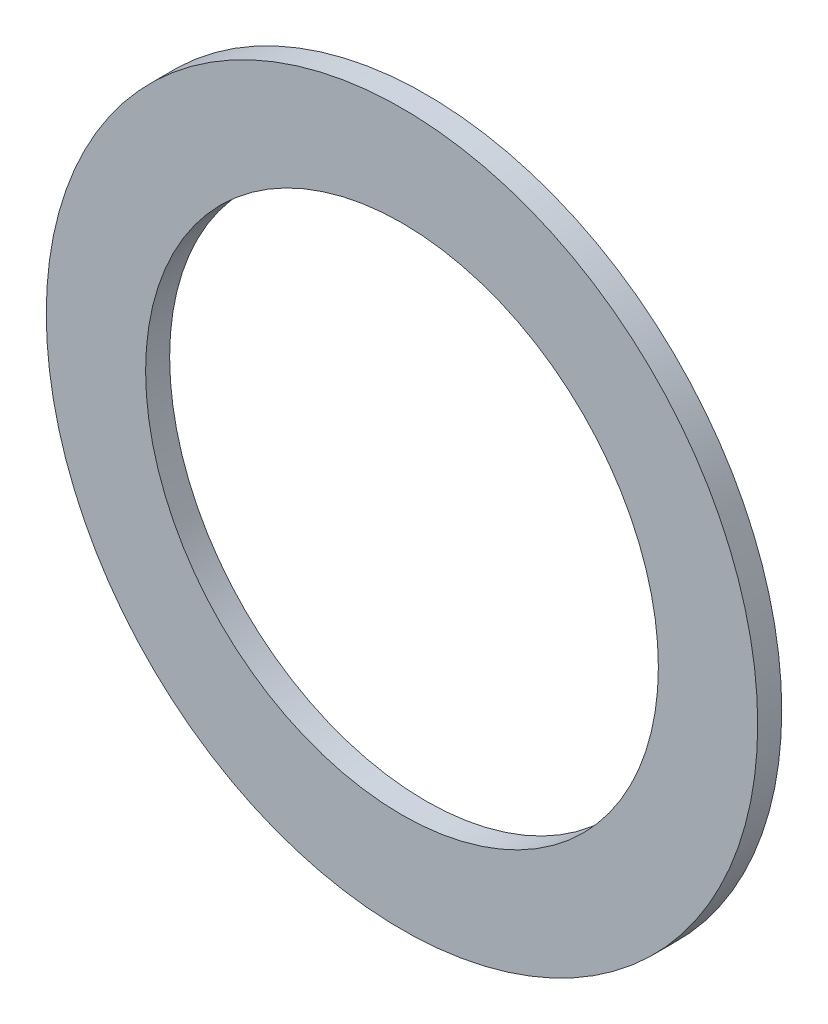
ISO-10303-21;
HEADER;
FILE_DESCRIPTION(('STEP AP214'),'2;1');
FILE_NAME('part.step','',(''),(''),'','','');
FILE_SCHEMA(('AUTOMOTIVE_DESIGN { 1 0 10303 214 1 1 1 1 }'));
ENDSEC;
DATA;
#1=APPLICATION_CONTEXT('core data for automotive mechanical design processes');
#2=APPLICATION_PROTOCOL_DEFINITION('international standard','automotive_design',2000,#1);
#3=PRODUCT_CONTEXT('',#1,'mechanical');
#4=PRODUCT('Part','Part','',(#3));
#5=PRODUCT_RELATED_PRODUCT_CATEGORY('part','',(#4));
#6=PRODUCT_DEFINITION_FORMATION('','',#4);
#7=PRODUCT_DEFINITION_CONTEXT('part definition',#1,'design');
#8=PRODUCT_DEFINITION('design','',#6,#7);
#9=PRODUCT_DEFINITION_SHAPE('','',#8);
#10=(LENGTH_UNIT() NAMED_UNIT(*) SI_UNIT(.MILLI.,.METRE.));
#11=(NAMED_UNIT(*) PLANE_ANGLE_UNIT() SI_UNIT($,.RADIAN.));
#12=(NAMED_UNIT(*) SI_UNIT($,.STERADIAN.) SOLID_ANGLE_UNIT());
#13=UNCERTAINTY_MEASURE_WITH_UNIT(LENGTH_MEASURE(1.E-05),#10,'distance_accuracy_value','');
#14=(GEOMETRIC_REPRESENTATION_CONTEXT(3) GLOBAL_UNCERTAINTY_ASSIGNED_CONTEXT((#13)) GLOBAL_UNIT_ASSIGNED_CONTEXT((#10,
#11,#12)) REPRESENTATION_CONTEXT('',''));
#15=CARTESIAN_POINT('',(0.,0.,0.));
#16=DIRECTION('',(0.,0.,1.));
#17=DIRECTION('',(1.,0.,0.));
#18=AXIS2_PLACEMENT_3D('',#15,#16,#17);
#19=CARTESIAN_POINT('',(0.,0.,21.5));
#20=DIRECTION('',(0.,0.,1.));
#21=DIRECTION('',(1.,0.,0.));
#22=AXIS2_PLACEMENT_3D('',#19,#20,#21);
#23=PLANE('',#22);
#24=CARTESIAN_POINT('',(0.,0.,21.5));
#25=DIRECTION('',(0.,0.,1.));
#26=DIRECTION('',(1.,0.,0.));
#27=AXIS2_PLACEMENT_3D('',#24,#25,#26);
#28=CIRCLE('',#27,22.2);
#29=CARTESIAN_POINT('',(22.2,0.,21.5));
#30=VERTEX_POINT('',#29);
#31=EDGE_CURVE('E10',#30,#30,#28,.T.);
#32=ORIENTED_EDGE('',*,*,#31,.T.);
#33=EDGE_LOOP('',(#32));
#34=FACE_BOUND('',#33,.T.);
#35=CARTESIAN_POINT('',(0.,0.,21.5));
#36=DIRECTION('',(0.,0.,1.));
#37=DIRECTION('',(1.,0.,0.));
#38=AXIS2_PLACEMENT_3D('',#35,#36,#37);
#39=CIRCLE('',#38,16.);
#40=CARTESIAN_POINT('',(16.,0.,21.5));
#41=VERTEX_POINT('',#40);
#42=EDGE_CURVE('E50',#41,#41,#39,.T.);
#43=ORIENTED_EDGE('',*,*,#42,.F.);
#44=EDGE_LOOP('',(#43));
#45=FACE_BOUND('',#44,.T.);
#46=ADVANCED_FACE('F36',(#34,#45),#23,.T.);
#47=CARTESIAN_POINT('',(0.,0.,20.));
#48=DIRECTION('',(0.,0.,1.));
#49=DIRECTION('',(1.,0.,0.));
#50=AXIS2_PLACEMENT_3D('',#47,#48,#49);
#51=PLANE('',#50);
#52=CARTESIAN_POINT('',(0.,0.,20.));
#53=DIRECTION('',(0.,0.,1.));
#54=DIRECTION('',(1.,0.,0.));
#55=AXIS2_PLACEMENT_3D('',#52,#53,#54);
#56=CIRCLE('',#55,22.2);
#57=CARTESIAN_POINT('',(22.2,0.,20.));
#58=VERTEX_POINT('',#57);
#59=EDGE_CURVE('E40',#58,#58,#56,.T.);
#60=ORIENTED_EDGE('',*,*,#59,.F.);
#61=EDGE_LOOP('',(#60));
#62=FACE_BOUND('',#61,.T.);
#63=CARTESIAN_POINT('',(0.,0.,20.));
#64=DIRECTION('',(0.,0.,1.));
#65=DIRECTION('',(1.,0.,0.));
#66=AXIS2_PLACEMENT_3D('',#63,#64,#65);
#67=CIRCLE('',#66,16.);
#68=CARTESIAN_POINT('',(16.,0.,20.));
#69=VERTEX_POINT('',#68);
#70=EDGE_CURVE('E52',#69,#69,#67,.T.);
#71=ORIENTED_EDGE('',*,*,#70,.T.);
#72=EDGE_LOOP('',(#71));
#73=FACE_BOUND('',#72,.T.);
#74=ADVANCED_FACE('F63',(#62,#73),#51,.F.);
#75=CARTESIAN_POINT('',(0.,0.,21.5));
#76=DIRECTION('',(0.,0.,-1.));
#77=DIRECTION('',(-1.,0.,0.));
#78=AXIS2_PLACEMENT_3D('',#75,#76,#77);
#79=CYLINDRICAL_SURFACE('',#78,22.2);
#80=ORIENTED_EDGE('',*,*,#31,.F.);
#81=EDGE_LOOP('',(#80));
#82=FACE_BOUND('',#81,.T.);
#83=ORIENTED_EDGE('',*,*,#59,.T.);
#84=EDGE_LOOP('',(#83));
#85=FACE_BOUND('',#84,.T.);
#86=ADVANCED_FACE('F38',(#82,#85),#79,.T.);
#87=CARTESIAN_POINT('',(0.,0.,21.5));
#88=DIRECTION('',(0.,0.,-1.));
#89=DIRECTION('',(-1.,0.,0.));
#90=AXIS2_PLACEMENT_3D('',#87,#88,#89);
#91=CYLINDRICAL_SURFACE('',#90,16.);
#92=ORIENTED_EDGE('',*,*,#42,.T.);
#93=EDGE_LOOP('',(#92));
#94=FACE_BOUND('',#93,.T.);
#95=ORIENTED_EDGE('',*,*,#70,.F.);
#96=EDGE_LOOP('',(#95));
#97=FACE_BOUND('',#96,.T.);
#98=ADVANCED_FACE('F59',(#94,#97),#91,.F.);
#99=CLOSED_SHELL('',(#46,#74,#86,#98));
#100=MANIFOLD_SOLID_BREP('B2',#99);
#101=ADVANCED_BREP_SHAPE_REPRESENTATION('',(#18,#100),#14);
#102=SHAPE_DEFINITION_REPRESENTATION(#9,#101);
ENDSEC;
END-ISO-10303-21;
